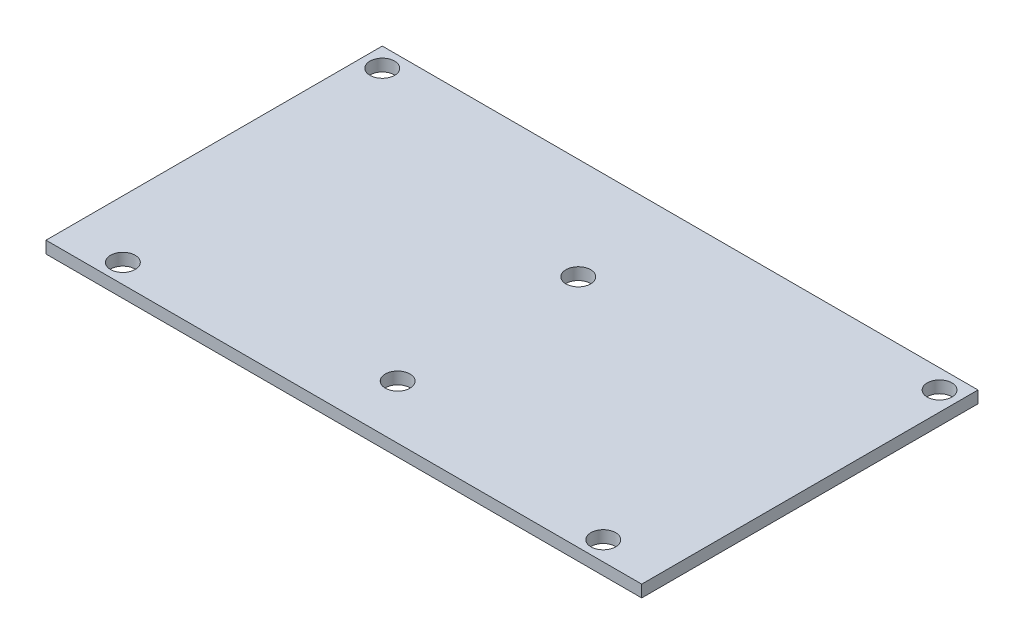
ISO-10303-21;
HEADER;
FILE_DESCRIPTION(('STEP AP214'),'2;1');
FILE_NAME('part.step','',(''),(''),'','','');
FILE_SCHEMA(('AUTOMOTIVE_DESIGN { 1 0 10303 214 1 1 1 1 }'));
ENDSEC;
DATA;
#1=APPLICATION_CONTEXT('core data for automotive mechanical design processes');
#2=APPLICATION_PROTOCOL_DEFINITION('international standard','automotive_design',2000,#1);
#3=PRODUCT_CONTEXT('',#1,'mechanical');
#4=PRODUCT('Part','Part','',(#3));
#5=PRODUCT_RELATED_PRODUCT_CATEGORY('part','',(#4));
#6=PRODUCT_DEFINITION_FORMATION('','',#4);
#7=PRODUCT_DEFINITION_CONTEXT('part definition',#1,'design');
#8=PRODUCT_DEFINITION('design','',#6,#7);
#9=PRODUCT_DEFINITION_SHAPE('','',#8);
#10=(LENGTH_UNIT() NAMED_UNIT(*) SI_UNIT(.MILLI.,.METRE.));
#11=(NAMED_UNIT(*) PLANE_ANGLE_UNIT() SI_UNIT($,.RADIAN.));
#12=(NAMED_UNIT(*) SI_UNIT($,.STERADIAN.) SOLID_ANGLE_UNIT());
#13=UNCERTAINTY_MEASURE_WITH_UNIT(LENGTH_MEASURE(1.E-05),#10,'distance_accuracy_value','');
#14=(GEOMETRIC_REPRESENTATION_CONTEXT(3) GLOBAL_UNCERTAINTY_ASSIGNED_CONTEXT((#13)) GLOBAL_UNIT_ASSIGNED_CONTEXT((#10,
#11,#12)) REPRESENTATION_CONTEXT('',''));
#15=CARTESIAN_POINT('',(0.,0.,0.));
#16=DIRECTION('',(0.,0.,1.));
#17=DIRECTION('',(1.,0.,0.));
#18=AXIS2_PLACEMENT_3D('',#15,#16,#17);
#19=CARTESIAN_POINT('',(39.37,1.5875,-22.225));
#20=DIRECTION('',(-1.,0.,0.));
#21=DIRECTION('',(0.,0.,1.));
#22=AXIS2_PLACEMENT_3D('',#19,#20,#21);
#23=PLANE('',#22);
#24=DIRECTION('',(0.,0.,-1.));
#25=VECTOR('',#24,1.);
#26=CARTESIAN_POINT('',(39.37,0.,-22.225));
#27=LINE('',#26,#25);
#28=CARTESIAN_POINT('',(39.37,0.,22.225));
#29=VERTEX_POINT('',#28);
#30=CARTESIAN_POINT('',(39.37,0.,-22.225));
#31=VERTEX_POINT('',#30);
#32=EDGE_CURVE('E107',#29,#31,#27,.T.);
#33=ORIENTED_EDGE('',*,*,#32,.T.);
#34=DIRECTION('',(0.,-1.,0.));
#35=VECTOR('',#34,1.);
#36=CARTESIAN_POINT('',(39.37,1.5875,-22.225));
#37=LINE('',#36,#35);
#38=CARTESIAN_POINT('',(39.37,1.5875,-22.225));
#39=VERTEX_POINT('',#38);
#40=EDGE_CURVE('E13',#39,#31,#37,.T.);
#41=ORIENTED_EDGE('',*,*,#40,.F.);
#42=DIRECTION('',(0.,0.,-1.));
#43=VECTOR('',#42,1.);
#44=CARTESIAN_POINT('',(39.37,1.5875,-22.225));
#45=LINE('',#44,#43);
#46=CARTESIAN_POINT('',(39.37,1.5875,22.225));
#47=VERTEX_POINT('',#46);
#48=EDGE_CURVE('E95',#47,#39,#45,.T.);
#49=ORIENTED_EDGE('',*,*,#48,.F.);
#50=DIRECTION('',(0.,-1.,0.));
#51=VECTOR('',#50,1.);
#52=CARTESIAN_POINT('',(39.37,1.5875,22.225));
#53=LINE('',#52,#51);
#54=EDGE_CURVE('E103',#47,#29,#53,.T.);
#55=ORIENTED_EDGE('',*,*,#54,.T.);
#56=EDGE_LOOP('',(#33,#41,#49,#55));
#57=FACE_BOUND('',#56,.T.);
#58=ADVANCED_FACE('F44',(#57),#23,.F.);
#59=CARTESIAN_POINT('',(-39.37,1.5875,-22.225));
#60=DIRECTION('',(0.,0.,1.));
#61=DIRECTION('',(1.,0.,0.));
#62=AXIS2_PLACEMENT_3D('',#59,#60,#61);
#63=PLANE('',#62);
#64=DIRECTION('',(-1.,0.,0.));
#65=VECTOR('',#64,1.);
#66=CARTESIAN_POINT('',(-39.37,0.,-22.225));
#67=LINE('',#66,#65);
#68=CARTESIAN_POINT('',(-39.37,0.,-22.225));
#69=VERTEX_POINT('',#68);
#70=EDGE_CURVE('E99',#31,#69,#67,.T.);
#71=ORIENTED_EDGE('',*,*,#70,.T.);
#72=DIRECTION('',(0.,-1.,0.));
#73=VECTOR('',#72,1.);
#74=CARTESIAN_POINT('',(-39.37,1.5875,-22.225));
#75=LINE('',#74,#73);
#76=CARTESIAN_POINT('',(-39.37,1.5875,-22.225));
#77=VERTEX_POINT('',#76);
#78=EDGE_CURVE('E52',#77,#69,#75,.T.);
#79=ORIENTED_EDGE('',*,*,#78,.F.);
#80=DIRECTION('',(-1.,0.,0.));
#81=VECTOR('',#80,1.);
#82=CARTESIAN_POINT('',(-39.37,1.5875,-22.225));
#83=LINE('',#82,#81);
#84=EDGE_CURVE('E90',#39,#77,#83,.T.);
#85=ORIENTED_EDGE('',*,*,#84,.F.);
#86=ORIENTED_EDGE('',*,*,#40,.T.);
#87=EDGE_LOOP('',(#71,#79,#85,#86));
#88=FACE_BOUND('',#87,.T.);
#89=ADVANCED_FACE('F98',(#88),#63,.F.);
#90=CARTESIAN_POINT('',(-39.37,1.5875,-22.225));
#91=DIRECTION('',(1.,0.,0.));
#92=DIRECTION('',(0.,0.,-1.));
#93=AXIS2_PLACEMENT_3D('',#90,#91,#92);
#94=PLANE('',#93);
#95=DIRECTION('',(0.,0.,1.));
#96=VECTOR('',#95,1.);
#97=CARTESIAN_POINT('',(-39.37,0.,-22.225));
#98=LINE('',#97,#96);
#99=CARTESIAN_POINT('',(-39.37,0.,22.225));
#100=VERTEX_POINT('',#99);
#101=EDGE_CURVE('E77',#69,#100,#98,.T.);
#102=ORIENTED_EDGE('',*,*,#101,.T.);
#103=DIRECTION('',(0.,-1.,0.));
#104=VECTOR('',#103,1.);
#105=CARTESIAN_POINT('',(-39.37,1.5875,22.225));
#106=LINE('',#105,#104);
#107=CARTESIAN_POINT('',(-39.37,1.5875,22.225));
#108=VERTEX_POINT('',#107);
#109=EDGE_CURVE('E100',#108,#100,#106,.T.);
#110=ORIENTED_EDGE('',*,*,#109,.F.);
#111=DIRECTION('',(0.,0.,1.));
#112=VECTOR('',#111,1.);
#113=CARTESIAN_POINT('',(-39.37,1.5875,-22.225));
#114=LINE('',#113,#112);
#115=EDGE_CURVE('E93',#77,#108,#114,.T.);
#116=ORIENTED_EDGE('',*,*,#115,.F.);
#117=ORIENTED_EDGE('',*,*,#78,.T.);
#118=EDGE_LOOP('',(#102,#110,#116,#117));
#119=FACE_BOUND('',#118,.T.);
#120=ADVANCED_FACE('F101',(#119),#94,.F.);
#121=CARTESIAN_POINT('',(-39.37,1.5875,22.225));
#122=DIRECTION('',(0.,0.,-1.));
#123=DIRECTION('',(-1.,0.,0.));
#124=AXIS2_PLACEMENT_3D('',#121,#122,#123);
#125=PLANE('',#124);
#126=DIRECTION('',(1.,0.,0.));
#127=VECTOR('',#126,1.);
#128=CARTESIAN_POINT('',(-39.37,0.,22.225));
#129=LINE('',#128,#127);
#130=EDGE_CURVE('E83',#100,#29,#129,.T.);
#131=ORIENTED_EDGE('',*,*,#130,.T.);
#132=ORIENTED_EDGE('',*,*,#54,.F.);
#133=DIRECTION('',(1.,0.,0.));
#134=VECTOR('',#133,1.);
#135=CARTESIAN_POINT('',(-39.37,1.5875,22.225));
#136=LINE('',#135,#134);
#137=EDGE_CURVE('E60',#108,#47,#136,.T.);
#138=ORIENTED_EDGE('',*,*,#137,.F.);
#139=ORIENTED_EDGE('',*,*,#109,.T.);
#140=EDGE_LOOP('',(#131,#132,#138,#139));
#141=FACE_BOUND('',#140,.T.);
#142=ADVANCED_FACE('F115',(#141),#125,.F.);
#143=CARTESIAN_POINT('',(0.,1.5875,0.));
#144=DIRECTION('',(0.,1.,0.));
#145=DIRECTION('',(0.,0.,1.));
#146=AXIS2_PLACEMENT_3D('',#143,#144,#145);
#147=PLANE('',#146);
#148=CARTESIAN_POINT('',(0.,1.5875,-8.762995682));
#149=DIRECTION('',(0.,1.,0.));
#150=DIRECTION('',(0.,0.,1.));
#151=AXIS2_PLACEMENT_3D('',#148,#149,#150);
#152=CIRCLE('',#151,1.63194999999999);
#153=CARTESIAN_POINT('',(0.,1.5875,-7.13104568200001));
#154=VERTEX_POINT('',#153);
#155=EDGE_CURVE('E153',#154,#154,#152,.T.);
#156=ORIENTED_EDGE('',*,*,#155,.F.);
#157=EDGE_LOOP('',(#156));
#158=FACE_BOUND('',#157,.T.);
#159=CARTESIAN_POINT('',(0.,1.5875,15.113004318));
#160=DIRECTION('',(0.,1.,0.));
#161=DIRECTION('',(0.,0.,1.));
#162=AXIS2_PLACEMENT_3D('',#159,#160,#161);
#163=CIRCLE('',#162,1.63194999999999);
#164=CARTESIAN_POINT('',(0.,1.5875,16.744954318));
#165=VERTEX_POINT('',#164);
#166=EDGE_CURVE('E147',#165,#165,#163,.T.);
#167=ORIENTED_EDGE('',*,*,#166,.F.);
#168=EDGE_LOOP('',(#167));
#169=FACE_BOUND('',#168,.T.);
#170=CARTESIAN_POINT('',(-36.83,1.5875,-19.685));
#171=DIRECTION('',(0.,1.,0.));
#172=DIRECTION('',(0.,0.,1.));
#173=AXIS2_PLACEMENT_3D('',#170,#171,#172);
#174=CIRCLE('',#173,1.63195);
#175=CARTESIAN_POINT('',(-36.83,1.5875,-18.05305));
#176=VERTEX_POINT('',#175);
#177=EDGE_CURVE('E141',#176,#176,#174,.T.);
#178=ORIENTED_EDGE('',*,*,#177,.F.);
#179=EDGE_LOOP('',(#178));
#180=FACE_BOUND('',#179,.T.);
#181=CARTESIAN_POINT('',(36.83,1.5875,-19.685));
#182=DIRECTION('',(0.,1.,0.));
#183=DIRECTION('',(0.,0.,1.));
#184=AXIS2_PLACEMENT_3D('',#181,#182,#183);
#185=CIRCLE('',#184,1.63195);
#186=CARTESIAN_POINT('',(36.83,1.5875,-18.05305));
#187=VERTEX_POINT('',#186);
#188=EDGE_CURVE('E135',#187,#187,#185,.T.);
#189=ORIENTED_EDGE('',*,*,#188,.F.);
#190=EDGE_LOOP('',(#189));
#191=FACE_BOUND('',#190,.T.);
#192=CARTESIAN_POINT('',(31.75,1.5875,19.685));
#193=DIRECTION('',(0.,1.,0.));
#194=DIRECTION('',(0.,0.,1.));
#195=AXIS2_PLACEMENT_3D('',#192,#193,#194);
#196=CIRCLE('',#195,1.63195);
#197=CARTESIAN_POINT('',(31.75,1.5875,21.31695));
#198=VERTEX_POINT('',#197);
#199=EDGE_CURVE('E129',#198,#198,#196,.T.);
#200=ORIENTED_EDGE('',*,*,#199,.F.);
#201=EDGE_LOOP('',(#200));
#202=FACE_BOUND('',#201,.T.);
#203=CARTESIAN_POINT('',(-31.75,1.5875,19.685));
#204=DIRECTION('',(0.,1.,0.));
#205=DIRECTION('',(0.,0.,1.));
#206=AXIS2_PLACEMENT_3D('',#203,#204,#205);
#207=CIRCLE('',#206,1.63195);
#208=CARTESIAN_POINT('',(-31.75,1.5875,21.31695));
#209=VERTEX_POINT('',#208);
#210=EDGE_CURVE('E123',#209,#209,#207,.T.);
#211=ORIENTED_EDGE('',*,*,#210,.F.);
#212=EDGE_LOOP('',(#211));
#213=FACE_BOUND('',#212,.T.);
#214=ORIENTED_EDGE('',*,*,#48,.T.);
#215=ORIENTED_EDGE('',*,*,#84,.T.);
#216=ORIENTED_EDGE('',*,*,#115,.T.);
#217=ORIENTED_EDGE('',*,*,#137,.T.);
#218=EDGE_LOOP('',(#214,#215,#216,#217));
#219=FACE_BOUND('',#218,.T.);
#220=ADVANCED_FACE('F91',(#158,#169,#180,#191,#202,#213,#219),#147,.T.);
#221=CARTESIAN_POINT('',(0.,0.,0.));
#222=DIRECTION('',(0.,1.,0.));
#223=DIRECTION('',(0.,0.,1.));
#224=AXIS2_PLACEMENT_3D('',#221,#222,#223);
#225=PLANE('',#224);
#226=CARTESIAN_POINT('',(0.,0.,-8.762995682));
#227=DIRECTION('',(0.,1.,0.));
#228=DIRECTION('',(0.,0.,1.));
#229=AXIS2_PLACEMENT_3D('',#226,#227,#228);
#230=CIRCLE('',#229,1.63194999999999);
#231=CARTESIAN_POINT('',(0.,0.,-7.13104568200001));
#232=VERTEX_POINT('',#231);
#233=EDGE_CURVE('E150',#232,#232,#230,.T.);
#234=ORIENTED_EDGE('',*,*,#233,.T.);
#235=EDGE_LOOP('',(#234));
#236=FACE_BOUND('',#235,.T.);
#237=CARTESIAN_POINT('',(0.,0.,15.113004318));
#238=DIRECTION('',(0.,1.,0.));
#239=DIRECTION('',(0.,0.,1.));
#240=AXIS2_PLACEMENT_3D('',#237,#238,#239);
#241=CIRCLE('',#240,1.63194999999999);
#242=CARTESIAN_POINT('',(0.,0.,16.744954318));
#243=VERTEX_POINT('',#242);
#244=EDGE_CURVE('E144',#243,#243,#241,.T.);
#245=ORIENTED_EDGE('',*,*,#244,.T.);
#246=EDGE_LOOP('',(#245));
#247=FACE_BOUND('',#246,.T.);
#248=CARTESIAN_POINT('',(-36.83,0.,-19.685));
#249=DIRECTION('',(0.,1.,0.));
#250=DIRECTION('',(0.,0.,1.));
#251=AXIS2_PLACEMENT_3D('',#248,#249,#250);
#252=CIRCLE('',#251,1.63195);
#253=CARTESIAN_POINT('',(-36.83,0.,-18.05305));
#254=VERTEX_POINT('',#253);
#255=EDGE_CURVE('E138',#254,#254,#252,.T.);
#256=ORIENTED_EDGE('',*,*,#255,.T.);
#257=EDGE_LOOP('',(#256));
#258=FACE_BOUND('',#257,.T.);
#259=CARTESIAN_POINT('',(36.83,0.,-19.685));
#260=DIRECTION('',(0.,1.,0.));
#261=DIRECTION('',(0.,0.,1.));
#262=AXIS2_PLACEMENT_3D('',#259,#260,#261);
#263=CIRCLE('',#262,1.63195);
#264=CARTESIAN_POINT('',(36.83,0.,-18.05305));
#265=VERTEX_POINT('',#264);
#266=EDGE_CURVE('E132',#265,#265,#263,.T.);
#267=ORIENTED_EDGE('',*,*,#266,.T.);
#268=EDGE_LOOP('',(#267));
#269=FACE_BOUND('',#268,.T.);
#270=CARTESIAN_POINT('',(31.75,0.,19.685));
#271=DIRECTION('',(0.,1.,0.));
#272=DIRECTION('',(0.,0.,1.));
#273=AXIS2_PLACEMENT_3D('',#270,#271,#272);
#274=CIRCLE('',#273,1.63195);
#275=CARTESIAN_POINT('',(31.75,0.,21.31695));
#276=VERTEX_POINT('',#275);
#277=EDGE_CURVE('E126',#276,#276,#274,.T.);
#278=ORIENTED_EDGE('',*,*,#277,.T.);
#279=EDGE_LOOP('',(#278));
#280=FACE_BOUND('',#279,.T.);
#281=CARTESIAN_POINT('',(-31.75,0.,19.685));
#282=DIRECTION('',(0.,1.,0.));
#283=DIRECTION('',(0.,0.,1.));
#284=AXIS2_PLACEMENT_3D('',#281,#282,#283);
#285=CIRCLE('',#284,1.63195);
#286=CARTESIAN_POINT('',(-31.75,0.,21.31695));
#287=VERTEX_POINT('',#286);
#288=EDGE_CURVE('E110',#287,#287,#285,.T.);
#289=ORIENTED_EDGE('',*,*,#288,.T.);
#290=EDGE_LOOP('',(#289));
#291=FACE_BOUND('',#290,.T.);
#292=ORIENTED_EDGE('',*,*,#32,.F.);
#293=ORIENTED_EDGE('',*,*,#130,.F.);
#294=ORIENTED_EDGE('',*,*,#101,.F.);
#295=ORIENTED_EDGE('',*,*,#70,.F.);
#296=EDGE_LOOP('',(#292,#293,#294,#295));
#297=FACE_BOUND('',#296,.T.);
#298=ADVANCED_FACE('F118',(#236,#247,#258,#269,#280,#291,#297),#225,.F.);
#299=CARTESIAN_POINT('',(-31.75,1.5875,19.685));
#300=DIRECTION('',(0.,1.,0.));
#301=DIRECTION('',(0.,0.,1.));
#302=AXIS2_PLACEMENT_3D('',#299,#300,#301);
#303=CYLINDRICAL_SURFACE('',#302,1.63195);
#304=ORIENTED_EDGE('',*,*,#288,.F.);
#305=EDGE_LOOP('',(#304));
#306=FACE_BOUND('',#305,.T.);
#307=ORIENTED_EDGE('',*,*,#210,.T.);
#308=EDGE_LOOP('',(#307));
#309=FACE_BOUND('',#308,.T.);
#310=ADVANCED_FACE('F172',(#306,#309),#303,.F.);
#311=CARTESIAN_POINT('',(31.75,1.5875,19.685));
#312=DIRECTION('',(0.,1.,0.));
#313=DIRECTION('',(0.,0.,1.));
#314=AXIS2_PLACEMENT_3D('',#311,#312,#313);
#315=CYLINDRICAL_SURFACE('',#314,1.63195);
#316=ORIENTED_EDGE('',*,*,#277,.F.);
#317=EDGE_LOOP('',(#316));
#318=FACE_BOUND('',#317,.T.);
#319=ORIENTED_EDGE('',*,*,#199,.T.);
#320=EDGE_LOOP('',(#319));
#321=FACE_BOUND('',#320,.T.);
#322=ADVANCED_FACE('F174',(#318,#321),#315,.F.);
#323=CARTESIAN_POINT('',(36.83,1.5875,-19.685));
#324=DIRECTION('',(0.,1.,0.));
#325=DIRECTION('',(0.,0.,1.));
#326=AXIS2_PLACEMENT_3D('',#323,#324,#325);
#327=CYLINDRICAL_SURFACE('',#326,1.63195);
#328=ORIENTED_EDGE('',*,*,#266,.F.);
#329=EDGE_LOOP('',(#328));
#330=FACE_BOUND('',#329,.T.);
#331=ORIENTED_EDGE('',*,*,#188,.T.);
#332=EDGE_LOOP('',(#331));
#333=FACE_BOUND('',#332,.T.);
#334=ADVANCED_FACE('F181',(#330,#333),#327,.F.);
#335=CARTESIAN_POINT('',(-36.83,1.5875,-19.685));
#336=DIRECTION('',(0.,1.,0.));
#337=DIRECTION('',(0.,0.,1.));
#338=AXIS2_PLACEMENT_3D('',#335,#336,#337);
#339=CYLINDRICAL_SURFACE('',#338,1.63195);
#340=ORIENTED_EDGE('',*,*,#255,.F.);
#341=EDGE_LOOP('',(#340));
#342=FACE_BOUND('',#341,.T.);
#343=ORIENTED_EDGE('',*,*,#177,.T.);
#344=EDGE_LOOP('',(#343));
#345=FACE_BOUND('',#344,.T.);
#346=ADVANCED_FACE('F221',(#342,#345),#339,.F.);
#347=CARTESIAN_POINT('',(0.,1.5875,15.113004318));
#348=DIRECTION('',(0.,1.,0.));
#349=DIRECTION('',(0.,0.,1.));
#350=AXIS2_PLACEMENT_3D('',#347,#348,#349);
#351=CYLINDRICAL_SURFACE('',#350,1.63194999999999);
#352=ORIENTED_EDGE('',*,*,#244,.F.);
#353=EDGE_LOOP('',(#352));
#354=FACE_BOUND('',#353,.T.);
#355=ORIENTED_EDGE('',*,*,#166,.T.);
#356=EDGE_LOOP('',(#355));
#357=FACE_BOUND('',#356,.T.);
#358=ADVANCED_FACE('F216',(#354,#357),#351,.F.);
#359=CARTESIAN_POINT('',(0.,1.5875,-8.762995682));
#360=DIRECTION('',(0.,1.,0.));
#361=DIRECTION('',(0.,0.,1.));
#362=AXIS2_PLACEMENT_3D('',#359,#360,#361);
#363=CYLINDRICAL_SURFACE('',#362,1.63194999999999);
#364=ORIENTED_EDGE('',*,*,#233,.F.);
#365=EDGE_LOOP('',(#364));
#366=FACE_BOUND('',#365,.T.);
#367=ORIENTED_EDGE('',*,*,#155,.T.);
#368=EDGE_LOOP('',(#367));
#369=FACE_BOUND('',#368,.T.);
#370=ADVANCED_FACE('F157',(#366,#369),#363,.F.);
#371=CLOSED_SHELL('',(#58,#89,#120,#142,#220,#298,#310,#322,#334,#346,#358,#370));
#372=MANIFOLD_SOLID_BREP('B2',#371);
#373=ADVANCED_BREP_SHAPE_REPRESENTATION('',(#18,#372),#14);
#374=SHAPE_DEFINITION_REPRESENTATION(#9,#373);
ENDSEC;
END-ISO-10303-21;
